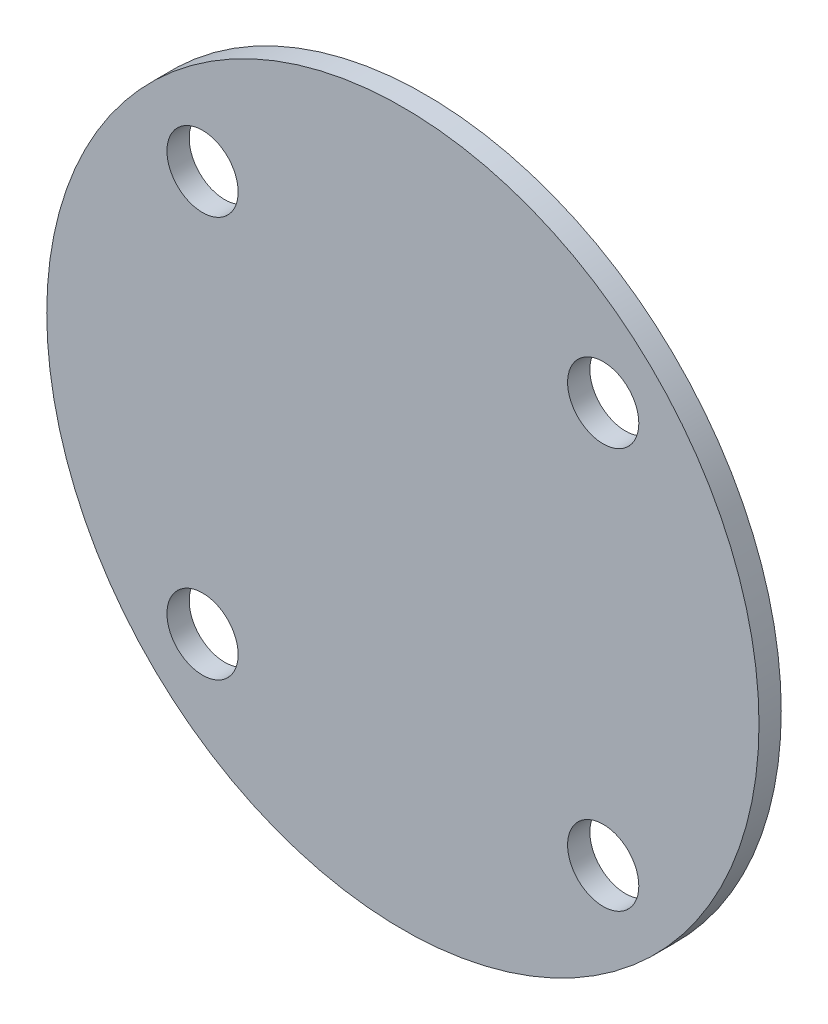
ISO-10303-21;
HEADER;
FILE_DESCRIPTION(('STEP AP214'),'2;1');
FILE_NAME('part.step','',(''),(''),'','','');
FILE_SCHEMA(('AUTOMOTIVE_DESIGN { 1 0 10303 214 1 1 1 1 }'));
ENDSEC;
DATA;
#1=APPLICATION_CONTEXT('core data for automotive mechanical design processes');
#2=APPLICATION_PROTOCOL_DEFINITION('international standard','automotive_design',2000,#1);
#3=PRODUCT_CONTEXT('',#1,'mechanical');
#4=PRODUCT('Part','Part','',(#3));
#5=PRODUCT_RELATED_PRODUCT_CATEGORY('part','',(#4));
#6=PRODUCT_DEFINITION_FORMATION('','',#4);
#7=PRODUCT_DEFINITION_CONTEXT('part definition',#1,'design');
#8=PRODUCT_DEFINITION('design','',#6,#7);
#9=PRODUCT_DEFINITION_SHAPE('','',#8);
#10=(LENGTH_UNIT() NAMED_UNIT(*) SI_UNIT(.MILLI.,.METRE.));
#11=(NAMED_UNIT(*) PLANE_ANGLE_UNIT() SI_UNIT($,.RADIAN.));
#12=(NAMED_UNIT(*) SI_UNIT($,.STERADIAN.) SOLID_ANGLE_UNIT());
#13=UNCERTAINTY_MEASURE_WITH_UNIT(LENGTH_MEASURE(1.E-05),#10,'distance_accuracy_value','');
#14=(GEOMETRIC_REPRESENTATION_CONTEXT(3) GLOBAL_UNCERTAINTY_ASSIGNED_CONTEXT((#13)) GLOBAL_UNIT_ASSIGNED_CONTEXT((#10,
#11,#12)) REPRESENTATION_CONTEXT('',''));
#15=CARTESIAN_POINT('',(0.,0.,0.));
#16=DIRECTION('',(0.,0.,1.));
#17=DIRECTION('',(1.,0.,0.));
#18=AXIS2_PLACEMENT_3D('',#15,#16,#17);
#19=CARTESIAN_POINT('',(0.,0.,1.));
#20=DIRECTION('',(0.,0.,-1.));
#21=DIRECTION('',(-1.,0.,0.));
#22=AXIS2_PLACEMENT_3D('',#19,#20,#21);
#23=CYLINDRICAL_SURFACE('',#22,16.);
#24=CARTESIAN_POINT('',(0.,0.,1.));
#25=DIRECTION('',(0.,0.,1.));
#26=DIRECTION('',(1.,0.,0.));
#27=AXIS2_PLACEMENT_3D('',#24,#25,#26);
#28=CIRCLE('',#27,16.);
#29=CARTESIAN_POINT('',(16.,0.,1.));
#30=VERTEX_POINT('',#29);
#31=EDGE_CURVE('E10',#30,#30,#28,.T.);
#32=ORIENTED_EDGE('',*,*,#31,.F.);
#33=EDGE_LOOP('',(#32));
#34=FACE_BOUND('',#33,.T.);
#35=CARTESIAN_POINT('',(0.,0.,0.));
#36=DIRECTION('',(0.,0.,1.));
#37=DIRECTION('',(1.,0.,0.));
#38=AXIS2_PLACEMENT_3D('',#35,#36,#37);
#39=CIRCLE('',#38,16.);
#40=CARTESIAN_POINT('',(16.,0.,0.));
#41=VERTEX_POINT('',#40);
#42=EDGE_CURVE('E42',#41,#41,#39,.T.);
#43=ORIENTED_EDGE('',*,*,#42,.T.);
#44=EDGE_LOOP('',(#43));
#45=FACE_BOUND('',#44,.T.);
#46=ADVANCED_FACE('F39',(#34,#45),#23,.T.);
#47=CARTESIAN_POINT('',(0.,0.,1.));
#48=DIRECTION('',(0.,0.,1.));
#49=DIRECTION('',(1.,0.,0.));
#50=AXIS2_PLACEMENT_3D('',#47,#48,#49);
#51=PLANE('',#50);
#52=CARTESIAN_POINT('',(-9.,9.,1.));
#53=DIRECTION('',(0.,0.,1.));
#54=DIRECTION('',(1.,0.,0.));
#55=AXIS2_PLACEMENT_3D('',#52,#53,#54);
#56=CIRCLE('',#55,1.6);
#57=CARTESIAN_POINT('',(-7.4,9.,1.));
#58=VERTEX_POINT('',#57);
#59=EDGE_CURVE('E57',#58,#58,#56,.T.);
#60=ORIENTED_EDGE('',*,*,#59,.F.);
#61=EDGE_LOOP('',(#60));
#62=FACE_BOUND('',#61,.T.);
#63=CARTESIAN_POINT('',(-9.,-9.,1.));
#64=DIRECTION('',(0.,0.,1.));
#65=DIRECTION('',(1.,0.,0.));
#66=AXIS2_PLACEMENT_3D('',#63,#64,#65);
#67=CIRCLE('',#66,1.6);
#68=CARTESIAN_POINT('',(-7.4,-9.,1.));
#69=VERTEX_POINT('',#68);
#70=EDGE_CURVE('E63',#69,#69,#67,.T.);
#71=ORIENTED_EDGE('',*,*,#70,.F.);
#72=EDGE_LOOP('',(#71));
#73=FACE_BOUND('',#72,.T.);
#74=CARTESIAN_POINT('',(9.,-9.,1.));
#75=DIRECTION('',(0.,0.,1.));
#76=DIRECTION('',(1.,0.,0.));
#77=AXIS2_PLACEMENT_3D('',#74,#75,#76);
#78=CIRCLE('',#77,1.6);
#79=CARTESIAN_POINT('',(10.6,-9.,1.));
#80=VERTEX_POINT('',#79);
#81=EDGE_CURVE('E69',#80,#80,#78,.T.);
#82=ORIENTED_EDGE('',*,*,#81,.F.);
#83=EDGE_LOOP('',(#82));
#84=FACE_BOUND('',#83,.T.);
#85=CARTESIAN_POINT('',(9.,9.,1.));
#86=DIRECTION('',(0.,0.,1.));
#87=DIRECTION('',(1.,0.,0.));
#88=AXIS2_PLACEMENT_3D('',#85,#86,#87);
#89=CIRCLE('',#88,1.6);
#90=CARTESIAN_POINT('',(10.6,9.,1.));
#91=VERTEX_POINT('',#90);
#92=EDGE_CURVE('E49',#91,#91,#89,.T.);
#93=ORIENTED_EDGE('',*,*,#92,.F.);
#94=EDGE_LOOP('',(#93));
#95=FACE_BOUND('',#94,.T.);
#96=ORIENTED_EDGE('',*,*,#31,.T.);
#97=EDGE_LOOP('',(#96));
#98=FACE_BOUND('',#97,.T.);
#99=ADVANCED_FACE('F94',(#62,#73,#84,#95,#98),#51,.T.);
#100=CARTESIAN_POINT('',(0.,0.,0.));
#101=DIRECTION('',(0.,0.,1.));
#102=DIRECTION('',(1.,0.,0.));
#103=AXIS2_PLACEMENT_3D('',#100,#101,#102);
#104=PLANE('',#103);
#105=CARTESIAN_POINT('',(-9.,9.,0.));
#106=DIRECTION('',(0.,0.,1.));
#107=DIRECTION('',(1.,0.,0.));
#108=AXIS2_PLACEMENT_3D('',#105,#106,#107);
#109=CIRCLE('',#108,1.6);
#110=CARTESIAN_POINT('',(-7.4,9.,0.));
#111=VERTEX_POINT('',#110);
#112=EDGE_CURVE('E60',#111,#111,#109,.T.);
#113=ORIENTED_EDGE('',*,*,#112,.T.);
#114=EDGE_LOOP('',(#113));
#115=FACE_BOUND('',#114,.T.);
#116=CARTESIAN_POINT('',(-9.,-9.,0.));
#117=DIRECTION('',(0.,0.,1.));
#118=DIRECTION('',(1.,0.,0.));
#119=AXIS2_PLACEMENT_3D('',#116,#117,#118);
#120=CIRCLE('',#119,1.6);
#121=CARTESIAN_POINT('',(-7.4,-9.,0.));
#122=VERTEX_POINT('',#121);
#123=EDGE_CURVE('E66',#122,#122,#120,.T.);
#124=ORIENTED_EDGE('',*,*,#123,.T.);
#125=EDGE_LOOP('',(#124));
#126=FACE_BOUND('',#125,.T.);
#127=CARTESIAN_POINT('',(9.,-9.,0.));
#128=DIRECTION('',(0.,0.,1.));
#129=DIRECTION('',(1.,0.,0.));
#130=AXIS2_PLACEMENT_3D('',#127,#128,#129);
#131=CIRCLE('',#130,1.6);
#132=CARTESIAN_POINT('',(10.6,-9.,0.));
#133=VERTEX_POINT('',#132);
#134=EDGE_CURVE('E54',#133,#133,#131,.T.);
#135=ORIENTED_EDGE('',*,*,#134,.T.);
#136=EDGE_LOOP('',(#135));
#137=FACE_BOUND('',#136,.T.);
#138=CARTESIAN_POINT('',(9.,9.,0.));
#139=DIRECTION('',(0.,0.,1.));
#140=DIRECTION('',(1.,0.,0.));
#141=AXIS2_PLACEMENT_3D('',#138,#139,#140);
#142=CIRCLE('',#141,1.6);
#143=CARTESIAN_POINT('',(10.6,9.,0.));
#144=VERTEX_POINT('',#143);
#145=EDGE_CURVE('E51',#144,#144,#142,.T.);
#146=ORIENTED_EDGE('',*,*,#145,.T.);
#147=EDGE_LOOP('',(#146));
#148=FACE_BOUND('',#147,.T.);
#149=ORIENTED_EDGE('',*,*,#42,.F.);
#150=EDGE_LOOP('',(#149));
#151=FACE_BOUND('',#150,.T.);
#152=ADVANCED_FACE('F75',(#115,#126,#137,#148,#151),#104,.F.);
#153=CARTESIAN_POINT('',(9.,9.,1.));
#154=DIRECTION('',(0.,0.,-1.));
#155=DIRECTION('',(-1.,0.,0.));
#156=AXIS2_PLACEMENT_3D('',#153,#154,#155);
#157=CYLINDRICAL_SURFACE('',#156,1.6);
#158=ORIENTED_EDGE('',*,*,#92,.T.);
#159=EDGE_LOOP('',(#158));
#160=FACE_BOUND('',#159,.T.);
#161=ORIENTED_EDGE('',*,*,#145,.F.);
#162=EDGE_LOOP('',(#161));
#163=FACE_BOUND('',#162,.T.);
#164=ADVANCED_FACE('F81',(#160,#163),#157,.F.);
#165=CARTESIAN_POINT('',(9.,-9.,1.));
#166=DIRECTION('',(0.,0.,-1.));
#167=DIRECTION('',(-1.,0.,0.));
#168=AXIS2_PLACEMENT_3D('',#165,#166,#167);
#169=CYLINDRICAL_SURFACE('',#168,1.6);
#170=ORIENTED_EDGE('',*,*,#81,.T.);
#171=EDGE_LOOP('',(#170));
#172=FACE_BOUND('',#171,.T.);
#173=ORIENTED_EDGE('',*,*,#134,.F.);
#174=EDGE_LOOP('',(#173));
#175=FACE_BOUND('',#174,.T.);
#176=ADVANCED_FACE('F78',(#172,#175),#169,.F.);
#177=CARTESIAN_POINT('',(-9.,-9.,1.));
#178=DIRECTION('',(0.,0.,-1.));
#179=DIRECTION('',(-1.,0.,0.));
#180=AXIS2_PLACEMENT_3D('',#177,#178,#179);
#181=CYLINDRICAL_SURFACE('',#180,1.6);
#182=ORIENTED_EDGE('',*,*,#70,.T.);
#183=EDGE_LOOP('',(#182));
#184=FACE_BOUND('',#183,.T.);
#185=ORIENTED_EDGE('',*,*,#123,.F.);
#186=EDGE_LOOP('',(#185));
#187=FACE_BOUND('',#186,.T.);
#188=ADVANCED_FACE('F80',(#184,#187),#181,.F.);
#189=CARTESIAN_POINT('',(-9.,9.,1.));
#190=DIRECTION('',(0.,0.,-1.));
#191=DIRECTION('',(-1.,0.,0.));
#192=AXIS2_PLACEMENT_3D('',#189,#190,#191);
#193=CYLINDRICAL_SURFACE('',#192,1.6);
#194=ORIENTED_EDGE('',*,*,#59,.T.);
#195=EDGE_LOOP('',(#194));
#196=FACE_BOUND('',#195,.T.);
#197=ORIENTED_EDGE('',*,*,#112,.F.);
#198=EDGE_LOOP('',(#197));
#199=FACE_BOUND('',#198,.T.);
#200=ADVANCED_FACE('F88',(#196,#199),#193,.F.);
#201=CLOSED_SHELL('',(#46,#99,#152,#164,#176,#188,#200));
#202=MANIFOLD_SOLID_BREP('B2',#201);
#203=ADVANCED_BREP_SHAPE_REPRESENTATION('',(#18,#202),#14);
#204=SHAPE_DEFINITION_REPRESENTATION(#9,#203);
ENDSEC;
END-ISO-10303-21;
